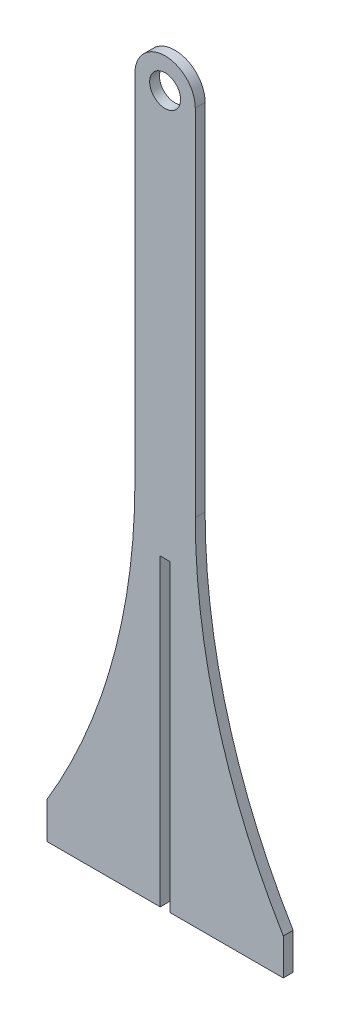
ISO-10303-21;
HEADER;
FILE_DESCRIPTION(('STEP AP214'),'2;1');
FILE_NAME('part.step','',(''),(''),'','','');
FILE_SCHEMA(('AUTOMOTIVE_DESIGN { 1 0 10303 214 1 1 1 1 }'));
ENDSEC;
DATA;
#1=APPLICATION_CONTEXT('core data for automotive mechanical design processes');
#2=APPLICATION_PROTOCOL_DEFINITION('international standard','automotive_design',2000,#1);
#3=PRODUCT_CONTEXT('',#1,'mechanical');
#4=PRODUCT('Part','Part','',(#3));
#5=PRODUCT_RELATED_PRODUCT_CATEGORY('part','',(#4));
#6=PRODUCT_DEFINITION_FORMATION('','',#4);
#7=PRODUCT_DEFINITION_CONTEXT('part definition',#1,'design');
#8=PRODUCT_DEFINITION('design','',#6,#7);
#9=PRODUCT_DEFINITION_SHAPE('','',#8);
#10=(LENGTH_UNIT() NAMED_UNIT(*) SI_UNIT(.MILLI.,.METRE.));
#11=(NAMED_UNIT(*) PLANE_ANGLE_UNIT() SI_UNIT($,.RADIAN.));
#12=(NAMED_UNIT(*) SI_UNIT($,.STERADIAN.) SOLID_ANGLE_UNIT());
#13=UNCERTAINTY_MEASURE_WITH_UNIT(LENGTH_MEASURE(1.E-05),#10,'distance_accuracy_value','');
#14=(GEOMETRIC_REPRESENTATION_CONTEXT(3) GLOBAL_UNCERTAINTY_ASSIGNED_CONTEXT((#13)) GLOBAL_UNIT_ASSIGNED_CONTEXT((#10,
#11,#12)) REPRESENTATION_CONTEXT('',''));
#15=CARTESIAN_POINT('',(0.,0.,0.));
#16=DIRECTION('',(0.,0.,1.));
#17=DIRECTION('',(1.,0.,0.));
#18=AXIS2_PLACEMENT_3D('',#15,#16,#17);
#19=CARTESIAN_POINT('',(-65.0000000000001,0.,-5.4));
#20=DIRECTION('',(0.,-1.,0.));
#21=DIRECTION('',(1.,0.,0.));
#22=AXIS2_PLACEMENT_3D('',#19,#20,#21);
#23=PLANE('',#22);
#24=DIRECTION('',(1.,0.,0.));
#25=VECTOR('',#24,1.);
#26=CARTESIAN_POINT('',(-65.0000000000001,0.,0.));
#27=LINE('',#26,#25);
#28=CARTESIAN_POINT('',(2.69999999999999,0.,0.));
#29=VERTEX_POINT('',#28);
#30=CARTESIAN_POINT('',(65.0000000000001,0.,0.));
#31=VERTEX_POINT('',#30);
#32=EDGE_CURVE('E162',#29,#31,#27,.T.);
#33=ORIENTED_EDGE('',*,*,#32,.F.);
#34=DIRECTION('',(0.,0.,1.));
#35=VECTOR('',#34,1.);
#36=CARTESIAN_POINT('',(2.7,0.,-84.65));
#37=LINE('',#36,#35);
#38=CARTESIAN_POINT('',(2.7,0.,-5.40000000000003));
#39=VERTEX_POINT('',#38);
#40=EDGE_CURVE('E48',#39,#29,#37,.T.);
#41=ORIENTED_EDGE('',*,*,#40,.F.);
#42=DIRECTION('',(1.,0.,0.));
#43=VECTOR('',#42,1.);
#44=CARTESIAN_POINT('',(-65.0000000000001,0.,-5.4));
#45=LINE('',#44,#43);
#46=CARTESIAN_POINT('',(65.0000000000001,0.,-5.4));
#47=VERTEX_POINT('',#46);
#48=EDGE_CURVE('E144',#39,#47,#45,.T.);
#49=ORIENTED_EDGE('',*,*,#48,.T.);
#50=DIRECTION('',(0.,0.,1.));
#51=VECTOR('',#50,1.);
#52=CARTESIAN_POINT('',(65.0000000000001,0.,-5.4));
#53=LINE('',#52,#51);
#54=EDGE_CURVE('E127',#47,#31,#53,.T.);
#55=ORIENTED_EDGE('',*,*,#54,.T.);
#56=EDGE_LOOP('',(#33,#41,#49,#55));
#57=FACE_BOUND('',#56,.T.);
#58=ADVANCED_FACE('F33',(#57),#23,.T.);
#59=CARTESIAN_POINT('',(0.,390.,-5.4));
#60=DIRECTION('',(0.,0.,1.));
#61=DIRECTION('',(1.,0.,0.));
#62=AXIS2_PLACEMENT_3D('',#59,#60,#61);
#63=CYLINDRICAL_SURFACE('',#62,16.6);
#64=CARTESIAN_POINT('',(0.,390.,0.));
#65=DIRECTION('',(0.,0.,1.));
#66=DIRECTION('',(1.,0.,0.));
#67=AXIS2_PLACEMENT_3D('',#64,#65,#66);
#68=CIRCLE('',#67,16.6);
#69=CARTESIAN_POINT('',(16.6,390.,0.));
#70=VERTEX_POINT('',#69);
#71=CARTESIAN_POINT('',(-16.6,390.,0.));
#72=VERTEX_POINT('',#71);
#73=EDGE_CURVE('E149',#70,#72,#68,.T.);
#74=ORIENTED_EDGE('',*,*,#73,.F.);
#75=DIRECTION('',(0.,0.,1.));
#76=VECTOR('',#75,1.);
#77=CARTESIAN_POINT('',(16.6,390.,-5.4));
#78=LINE('',#77,#76);
#79=CARTESIAN_POINT('',(16.6,390.,-5.4));
#80=VERTEX_POINT('',#79);
#81=EDGE_CURVE('E57',#80,#70,#78,.T.);
#82=ORIENTED_EDGE('',*,*,#81,.F.);
#83=CARTESIAN_POINT('',(0.,390.,-5.4));
#84=DIRECTION('',(0.,0.,1.));
#85=DIRECTION('',(1.,0.,0.));
#86=AXIS2_PLACEMENT_3D('',#83,#84,#85);
#87=CIRCLE('',#86,16.6);
#88=CARTESIAN_POINT('',(-16.6,390.,-5.4));
#89=VERTEX_POINT('',#88);
#90=EDGE_CURVE('E172',#80,#89,#87,.T.);
#91=ORIENTED_EDGE('',*,*,#90,.T.);
#92=DIRECTION('',(0.,0.,1.));
#93=VECTOR('',#92,1.);
#94=CARTESIAN_POINT('',(-16.6,390.,-5.4));
#95=LINE('',#94,#93);
#96=EDGE_CURVE('E96',#89,#72,#95,.T.);
#97=ORIENTED_EDGE('',*,*,#96,.T.);
#98=EDGE_LOOP('',(#74,#82,#91,#97));
#99=FACE_BOUND('',#98,.T.);
#100=ADVANCED_FACE('F35',(#99),#63,.T.);
#101=CARTESIAN_POINT('',(16.6,390.,-5.4));
#102=DIRECTION('',(1.,0.,0.));
#103=DIRECTION('',(0.,0.,-1.));
#104=AXIS2_PLACEMENT_3D('',#101,#102,#103);
#105=PLANE('',#104);
#106=DIRECTION('',(0.,1.,0.));
#107=VECTOR('',#106,1.);
#108=CARTESIAN_POINT('',(16.6,390.,0.));
#109=LINE('',#108,#107);
#110=CARTESIAN_POINT('',(16.5999999999999,195.,0.));
#111=VERTEX_POINT('',#110);
#112=EDGE_CURVE('E169',#111,#70,#109,.T.);
#113=ORIENTED_EDGE('',*,*,#112,.F.);
#114=DIRECTION('',(0.,0.,1.));
#115=VECTOR('',#114,1.);
#116=CARTESIAN_POINT('',(16.5999999999999,195.,-5.4));
#117=LINE('',#116,#115);
#118=CARTESIAN_POINT('',(16.5999999999999,195.,-5.4));
#119=VERTEX_POINT('',#118);
#120=EDGE_CURVE('E126',#119,#111,#117,.T.);
#121=ORIENTED_EDGE('',*,*,#120,.F.);
#122=DIRECTION('',(0.,1.,0.));
#123=VECTOR('',#122,1.);
#124=CARTESIAN_POINT('',(16.6,390.,-5.4));
#125=LINE('',#124,#123);
#126=EDGE_CURVE('E136',#119,#80,#125,.T.);
#127=ORIENTED_EDGE('',*,*,#126,.T.);
#128=ORIENTED_EDGE('',*,*,#81,.T.);
#129=EDGE_LOOP('',(#113,#121,#127,#128));
#130=FACE_BOUND('',#129,.T.);
#131=ADVANCED_FACE('F195',(#130),#105,.T.);
#132=CARTESIAN_POINT('',(357.173966942148,195.,-5.4));
#133=DIRECTION('',(0.,0.,1.));
#134=DIRECTION('',(1.,0.,0.));
#135=AXIS2_PLACEMENT_3D('',#132,#133,#134);
#136=CYLINDRICAL_SURFACE('',#135,340.573966942148);
#137=CARTESIAN_POINT('',(357.173966942148,195.,0.));
#138=DIRECTION('',(0.,0.,-1.));
#139=DIRECTION('',(1.,0.,0.));
#140=AXIS2_PLACEMENT_3D('',#137,#138,#139);
#141=CIRCLE('',#140,340.573966942148);
#142=CARTESIAN_POINT('',(65.0000000000001,20.,0.));
#143=VERTEX_POINT('',#142);
#144=EDGE_CURVE('E121',#143,#111,#141,.T.);
#145=ORIENTED_EDGE('',*,*,#144,.F.);
#146=DIRECTION('',(0.,0.,1.));
#147=VECTOR('',#146,1.);
#148=CARTESIAN_POINT('',(65.0000000000001,20.,-5.4));
#149=LINE('',#148,#147);
#150=CARTESIAN_POINT('',(65.0000000000001,20.,-5.4));
#151=VERTEX_POINT('',#150);
#152=EDGE_CURVE('E115',#151,#143,#149,.T.);
#153=ORIENTED_EDGE('',*,*,#152,.F.);
#154=CARTESIAN_POINT('',(357.173966942148,195.,-5.4));
#155=DIRECTION('',(0.,0.,-1.));
#156=DIRECTION('',(1.,0.,0.));
#157=AXIS2_PLACEMENT_3D('',#154,#155,#156);
#158=CIRCLE('',#157,340.573966942148);
#159=EDGE_CURVE('E118',#151,#119,#158,.T.);
#160=ORIENTED_EDGE('',*,*,#159,.T.);
#161=ORIENTED_EDGE('',*,*,#120,.T.);
#162=EDGE_LOOP('',(#145,#153,#160,#161));
#163=FACE_BOUND('',#162,.T.);
#164=ADVANCED_FACE('F117',(#163),#136,.F.);
#165=CARTESIAN_POINT('',(65.0000000000001,0.,-5.4));
#166=DIRECTION('',(1.,0.,0.));
#167=DIRECTION('',(0.,0.,-1.));
#168=AXIS2_PLACEMENT_3D('',#165,#166,#167);
#169=PLANE('',#168);
#170=DIRECTION('',(0.,1.,0.));
#171=VECTOR('',#170,1.);
#172=CARTESIAN_POINT('',(65.0000000000001,0.,0.));
#173=LINE('',#172,#171);
#174=EDGE_CURVE('E166',#31,#143,#173,.T.);
#175=ORIENTED_EDGE('',*,*,#174,.F.);
#176=ORIENTED_EDGE('',*,*,#54,.F.);
#177=DIRECTION('',(0.,1.,0.));
#178=VECTOR('',#177,1.);
#179=CARTESIAN_POINT('',(65.0000000000001,0.,-5.4));
#180=LINE('',#179,#178);
#181=EDGE_CURVE('E135',#47,#151,#180,.T.);
#182=ORIENTED_EDGE('',*,*,#181,.T.);
#183=ORIENTED_EDGE('',*,*,#152,.T.);
#184=EDGE_LOOP('',(#175,#176,#182,#183));
#185=FACE_BOUND('',#184,.T.);
#186=ADVANCED_FACE('F139',(#185),#169,.T.);
#187=DIRECTION('',(0.,0.,1.));
#188=VECTOR('',#187,1.);
#189=CARTESIAN_POINT('',(-2.7,0.,-84.65));
#190=LINE('',#189,#188);
#191=CARTESIAN_POINT('',(-2.7,0.,-5.40000000000003));
#192=VERTEX_POINT('',#191);
#193=CARTESIAN_POINT('',(-2.7,0.,0.));
#194=VERTEX_POINT('',#193);
#195=EDGE_CURVE('E223',#192,#194,#190,.T.);
#196=ORIENTED_EDGE('',*,*,#195,.T.);
#197=CARTESIAN_POINT('',(-65.0000000000001,0.,0.));
#198=VERTEX_POINT('',#197);
#199=EDGE_CURVE('E163',#198,#194,#27,.T.);
#200=ORIENTED_EDGE('',*,*,#199,.F.);
#201=DIRECTION('',(0.,0.,1.));
#202=VECTOR('',#201,1.);
#203=CARTESIAN_POINT('',(-65.0000000000001,0.,-5.4));
#204=LINE('',#203,#202);
#205=CARTESIAN_POINT('',(-65.0000000000001,0.,-5.4));
#206=VERTEX_POINT('',#205);
#207=EDGE_CURVE('E176',#206,#198,#204,.T.);
#208=ORIENTED_EDGE('',*,*,#207,.F.);
#209=EDGE_CURVE('E141',#206,#192,#45,.T.);
#210=ORIENTED_EDGE('',*,*,#209,.T.);
#211=EDGE_LOOP('',(#196,#200,#208,#210));
#212=FACE_BOUND('',#211,.T.);
#213=ADVANCED_FACE('F206',(#212),#23,.T.);
#214=CARTESIAN_POINT('',(-65.0000000000001,0.,-5.4));
#215=DIRECTION('',(-1.,0.,0.));
#216=DIRECTION('',(0.,0.,1.));
#217=AXIS2_PLACEMENT_3D('',#214,#215,#216);
#218=PLANE('',#217);
#219=DIRECTION('',(0.,-1.,0.));
#220=VECTOR('',#219,1.);
#221=CARTESIAN_POINT('',(-65.0000000000001,0.,0.));
#222=LINE('',#221,#220);
#223=CARTESIAN_POINT('',(-65.0000000000001,20.,0.));
#224=VERTEX_POINT('',#223);
#225=EDGE_CURVE('E159',#224,#198,#222,.T.);
#226=ORIENTED_EDGE('',*,*,#225,.F.);
#227=DIRECTION('',(0.,0.,1.));
#228=VECTOR('',#227,1.);
#229=CARTESIAN_POINT('',(-65.0000000000001,20.,-5.4));
#230=LINE('',#229,#228);
#231=CARTESIAN_POINT('',(-65.0000000000001,20.,-5.4));
#232=VERTEX_POINT('',#231);
#233=EDGE_CURVE('E178',#232,#224,#230,.T.);
#234=ORIENTED_EDGE('',*,*,#233,.F.);
#235=DIRECTION('',(0.,-1.,0.));
#236=VECTOR('',#235,1.);
#237=CARTESIAN_POINT('',(-65.0000000000001,0.,-5.4));
#238=LINE('',#237,#236);
#239=EDGE_CURVE('E237',#232,#206,#238,.T.);
#240=ORIENTED_EDGE('',*,*,#239,.T.);
#241=ORIENTED_EDGE('',*,*,#207,.T.);
#242=EDGE_LOOP('',(#226,#234,#240,#241));
#243=FACE_BOUND('',#242,.T.);
#244=ADVANCED_FACE('F212',(#243),#218,.T.);
#245=CARTESIAN_POINT('',(-357.173966942148,195.,-5.4));
#246=DIRECTION('',(0.,0.,1.));
#247=DIRECTION('',(1.,0.,0.));
#248=AXIS2_PLACEMENT_3D('',#245,#246,#247);
#249=CYLINDRICAL_SURFACE('',#248,340.573966942148);
#250=CARTESIAN_POINT('',(-357.173966942148,195.,0.));
#251=DIRECTION('',(0.,0.,-1.));
#252=DIRECTION('',(1.,0.,0.));
#253=AXIS2_PLACEMENT_3D('',#250,#251,#252);
#254=CIRCLE('',#253,340.573966942148);
#255=CARTESIAN_POINT('',(-16.6,195.,0.));
#256=VERTEX_POINT('',#255);
#257=EDGE_CURVE('E156',#256,#224,#254,.T.);
#258=ORIENTED_EDGE('',*,*,#257,.F.);
#259=DIRECTION('',(0.,0.,1.));
#260=VECTOR('',#259,1.);
#261=CARTESIAN_POINT('',(-16.6,195.,-5.4));
#262=LINE('',#261,#260);
#263=CARTESIAN_POINT('',(-16.6,195.,-5.4));
#264=VERTEX_POINT('',#263);
#265=EDGE_CURVE('E180',#264,#256,#262,.T.);
#266=ORIENTED_EDGE('',*,*,#265,.F.);
#267=CARTESIAN_POINT('',(-357.173966942148,195.,-5.4));
#268=DIRECTION('',(0.,0.,-1.));
#269=DIRECTION('',(1.,0.,0.));
#270=AXIS2_PLACEMENT_3D('',#267,#268,#269);
#271=CIRCLE('',#270,340.573966942148);
#272=EDGE_CURVE('E260',#264,#232,#271,.T.);
#273=ORIENTED_EDGE('',*,*,#272,.T.);
#274=ORIENTED_EDGE('',*,*,#233,.T.);
#275=EDGE_LOOP('',(#258,#266,#273,#274));
#276=FACE_BOUND('',#275,.T.);
#277=ADVANCED_FACE('F218',(#276),#249,.F.);
#278=CARTESIAN_POINT('',(-16.6,390.,-5.4));
#279=DIRECTION('',(-1.,0.,0.));
#280=DIRECTION('',(0.,0.,1.));
#281=AXIS2_PLACEMENT_3D('',#278,#279,#280);
#282=PLANE('',#281);
#283=DIRECTION('',(0.,-1.,0.));
#284=VECTOR('',#283,1.);
#285=CARTESIAN_POINT('',(-16.6,390.,0.));
#286=LINE('',#285,#284);
#287=EDGE_CURVE('E152',#72,#256,#286,.T.);
#288=ORIENTED_EDGE('',*,*,#287,.F.);
#289=ORIENTED_EDGE('',*,*,#96,.F.);
#290=DIRECTION('',(0.,-1.,0.));
#291=VECTOR('',#290,1.);
#292=CARTESIAN_POINT('',(-16.6,390.,-5.4));
#293=LINE('',#292,#291);
#294=EDGE_CURVE('E258',#89,#264,#293,.T.);
#295=ORIENTED_EDGE('',*,*,#294,.T.);
#296=ORIENTED_EDGE('',*,*,#265,.T.);
#297=EDGE_LOOP('',(#288,#289,#295,#296));
#298=FACE_BOUND('',#297,.T.);
#299=ADVANCED_FACE('F262',(#298),#282,.T.);
#300=CARTESIAN_POINT('',(0.,390.,-5.4));
#301=DIRECTION('',(0.,0.,1.));
#302=DIRECTION('',(1.,0.,0.));
#303=AXIS2_PLACEMENT_3D('',#300,#301,#302);
#304=PLANE('',#303);
#305=DIRECTION('',(1.,0.,0.));
#306=VECTOR('',#305,1.);
#307=CARTESIAN_POINT('',(-2.7,167.1,-5.39999999999999));
#308=LINE('',#307,#306);
#309=CARTESIAN_POINT('',(-2.7,167.1,-5.39999999999999));
#310=VERTEX_POINT('',#309);
#311=CARTESIAN_POINT('',(2.7,167.1,-5.39999999999999));
#312=VERTEX_POINT('',#311);
#313=EDGE_CURVE('E244',#310,#312,#308,.T.);
#314=ORIENTED_EDGE('',*,*,#313,.F.);
#315=DIRECTION('',(0.,-1.,0.));
#316=VECTOR('',#315,1.);
#317=CARTESIAN_POINT('',(-2.7,390.,-5.4));
#318=LINE('',#317,#316);
#319=EDGE_CURVE('E240',#310,#192,#318,.T.);
#320=ORIENTED_EDGE('',*,*,#319,.T.);
#321=ORIENTED_EDGE('',*,*,#209,.F.);
#322=ORIENTED_EDGE('',*,*,#239,.F.);
#323=ORIENTED_EDGE('',*,*,#272,.F.);
#324=ORIENTED_EDGE('',*,*,#294,.F.);
#325=ORIENTED_EDGE('',*,*,#90,.F.);
#326=ORIENTED_EDGE('',*,*,#126,.F.);
#327=ORIENTED_EDGE('',*,*,#159,.F.);
#328=ORIENTED_EDGE('',*,*,#181,.F.);
#329=ORIENTED_EDGE('',*,*,#48,.F.);
#330=DIRECTION('',(0.,-1.,0.));
#331=VECTOR('',#330,1.);
#332=CARTESIAN_POINT('',(2.7,390.,-5.4));
#333=LINE('',#332,#331);
#334=EDGE_CURVE('E248',#312,#39,#333,.T.);
#335=ORIENTED_EDGE('',*,*,#334,.F.);
#336=EDGE_LOOP('',(#314,#320,#321,#322,#323,#324,#325,#326,#327,#328,#329,#335));
#337=FACE_BOUND('',#336,.T.);
#338=CARTESIAN_POINT('',(0.,390.,-5.4));
#339=DIRECTION('',(0.,0.,1.));
#340=DIRECTION('',(1.,0.,0.));
#341=AXIS2_PLACEMENT_3D('',#338,#339,#340);
#342=CIRCLE('',#341,8.5);
#343=CARTESIAN_POINT('',(8.5,390.,-5.4));
#344=VERTEX_POINT('',#343);
#345=EDGE_CURVE('E153',#344,#344,#342,.T.);
#346=ORIENTED_EDGE('',*,*,#345,.T.);
#347=EDGE_LOOP('',(#346));
#348=FACE_BOUND('',#347,.T.);
#349=ADVANCED_FACE('F132',(#337,#348),#304,.F.);
#350=CARTESIAN_POINT('',(0.,390.,0.));
#351=DIRECTION('',(0.,0.,1.));
#352=DIRECTION('',(1.,0.,0.));
#353=AXIS2_PLACEMENT_3D('',#350,#351,#352);
#354=PLANE('',#353);
#355=DIRECTION('',(0.,-1.,0.));
#356=VECTOR('',#355,1.);
#357=CARTESIAN_POINT('',(-2.7,390.,0.));
#358=LINE('',#357,#356);
#359=CARTESIAN_POINT('',(-2.7,167.1,0.));
#360=VERTEX_POINT('',#359);
#361=EDGE_CURVE('E11',#360,#194,#358,.T.);
#362=ORIENTED_EDGE('',*,*,#361,.F.);
#363=DIRECTION('',(1.,0.,0.));
#364=VECTOR('',#363,1.);
#365=CARTESIAN_POINT('',(-2.7,167.1,0.));
#366=LINE('',#365,#364);
#367=CARTESIAN_POINT('',(2.7,167.1,0.));
#368=VERTEX_POINT('',#367);
#369=EDGE_CURVE('E190',#360,#368,#366,.T.);
#370=ORIENTED_EDGE('',*,*,#369,.T.);
#371=DIRECTION('',(0.,-1.,0.));
#372=VECTOR('',#371,1.);
#373=CARTESIAN_POINT('',(2.7,390.,0.));
#374=LINE('',#373,#372);
#375=EDGE_CURVE('E41',#368,#29,#374,.T.);
#376=ORIENTED_EDGE('',*,*,#375,.T.);
#377=ORIENTED_EDGE('',*,*,#32,.T.);
#378=ORIENTED_EDGE('',*,*,#174,.T.);
#379=ORIENTED_EDGE('',*,*,#144,.T.);
#380=ORIENTED_EDGE('',*,*,#112,.T.);
#381=ORIENTED_EDGE('',*,*,#73,.T.);
#382=ORIENTED_EDGE('',*,*,#287,.T.);
#383=ORIENTED_EDGE('',*,*,#257,.T.);
#384=ORIENTED_EDGE('',*,*,#225,.T.);
#385=ORIENTED_EDGE('',*,*,#199,.T.);
#386=EDGE_LOOP('',(#362,#370,#376,#377,#378,#379,#380,#381,#382,#383,#384,#385));
#387=FACE_BOUND('',#386,.T.);
#388=CARTESIAN_POINT('',(0.,390.,0.));
#389=DIRECTION('',(0.,0.,1.));
#390=DIRECTION('',(1.,0.,0.));
#391=AXIS2_PLACEMENT_3D('',#388,#389,#390);
#392=CIRCLE('',#391,8.5);
#393=CARTESIAN_POINT('',(8.5,390.,0.));
#394=VERTEX_POINT('',#393);
#395=EDGE_CURVE('E247',#394,#394,#392,.T.);
#396=ORIENTED_EDGE('',*,*,#395,.F.);
#397=EDGE_LOOP('',(#396));
#398=FACE_BOUND('',#397,.T.);
#399=ADVANCED_FACE('F186',(#387,#398),#354,.T.);
#400=CARTESIAN_POINT('',(0.,390.,-5.4));
#401=DIRECTION('',(0.,0.,1.));
#402=DIRECTION('',(1.,0.,0.));
#403=AXIS2_PLACEMENT_3D('',#400,#401,#402);
#404=CYLINDRICAL_SURFACE('',#403,8.5);
#405=CARTESIAN_POINT('',(8.5,390.,-5.4));
#406=CARTESIAN_POINT('',(8.5,390.,-5.34375));
#407=CARTESIAN_POINT('',(8.5,390.,-5.2875));
#408=CARTESIAN_POINT('',(8.5,390.,-5.175));
#409=CARTESIAN_POINT('',(8.5,390.,-5.11875));
#410=CARTESIAN_POINT('',(8.5,390.,-5.00625));
#411=CARTESIAN_POINT('',(8.5,390.,-4.95));
#412=CARTESIAN_POINT('',(8.5,390.,-4.8375));
#413=CARTESIAN_POINT('',(8.5,390.,-4.78125));
#414=CARTESIAN_POINT('',(8.5,390.,-4.66875));
#415=CARTESIAN_POINT('',(8.5,390.,-4.6125));
#416=CARTESIAN_POINT('',(8.5,390.,-4.5));
#417=CARTESIAN_POINT('',(8.5,390.,-4.44375));
#418=CARTESIAN_POINT('',(8.5,390.,-4.33125));
#419=CARTESIAN_POINT('',(8.5,390.,-4.275));
#420=CARTESIAN_POINT('',(8.5,390.,-4.1625));
#421=CARTESIAN_POINT('',(8.5,390.,-4.10625));
#422=CARTESIAN_POINT('',(8.5,390.,-3.99375));
#423=CARTESIAN_POINT('',(8.5,390.,-3.9375));
#424=CARTESIAN_POINT('',(8.5,390.,-3.825));
#425=CARTESIAN_POINT('',(8.5,390.,-3.76875));
#426=CARTESIAN_POINT('',(8.5,390.,-3.65625));
#427=CARTESIAN_POINT('',(8.5,390.,-3.6));
#428=CARTESIAN_POINT('',(8.5,390.,-3.4875));
#429=CARTESIAN_POINT('',(8.5,390.,-3.43125));
#430=CARTESIAN_POINT('',(8.5,390.,-3.31875));
#431=CARTESIAN_POINT('',(8.5,390.,-3.2625));
#432=CARTESIAN_POINT('',(8.5,390.,-3.15));
#433=CARTESIAN_POINT('',(8.5,390.,-3.09375));
#434=CARTESIAN_POINT('',(8.5,390.,-2.98125));
#435=CARTESIAN_POINT('',(8.5,390.,-2.925));
#436=CARTESIAN_POINT('',(8.5,390.,-2.8125));
#437=CARTESIAN_POINT('',(8.5,390.,-2.75625));
#438=CARTESIAN_POINT('',(8.5,390.,-2.64375));
#439=CARTESIAN_POINT('',(8.5,390.,-2.5875));
#440=CARTESIAN_POINT('',(8.5,390.,-2.475));
#441=CARTESIAN_POINT('',(8.5,390.,-2.41875));
#442=CARTESIAN_POINT('',(8.5,390.,-2.30625));
#443=CARTESIAN_POINT('',(8.5,390.,-2.25));
#444=CARTESIAN_POINT('',(8.5,390.,-2.1375));
#445=CARTESIAN_POINT('',(8.5,390.,-2.08125));
#446=CARTESIAN_POINT('',(8.5,390.,-1.96875));
#447=CARTESIAN_POINT('',(8.5,390.,-1.9125));
#448=CARTESIAN_POINT('',(8.5,390.,-1.8));
#449=CARTESIAN_POINT('',(8.5,390.,-1.74375));
#450=CARTESIAN_POINT('',(8.5,390.,-1.63125));
#451=CARTESIAN_POINT('',(8.5,390.,-1.575));
#452=CARTESIAN_POINT('',(8.5,390.,-1.4625));
#453=CARTESIAN_POINT('',(8.5,390.,-1.40625));
#454=CARTESIAN_POINT('',(8.5,390.,-1.29375));
#455=CARTESIAN_POINT('',(8.5,390.,-1.2375));
#456=CARTESIAN_POINT('',(8.5,390.,-1.125));
#457=CARTESIAN_POINT('',(8.5,390.,-1.06875));
#458=CARTESIAN_POINT('',(8.5,390.,-0.956250000000001));
#459=CARTESIAN_POINT('',(8.5,390.,-0.900000000000001));
#460=CARTESIAN_POINT('',(8.5,390.,-0.787500000000001));
#461=CARTESIAN_POINT('',(8.5,390.,-0.731250000000001));
#462=CARTESIAN_POINT('',(8.5,390.,-0.618750000000001));
#463=CARTESIAN_POINT('',(8.5,390.,-0.562500000000001));
#464=CARTESIAN_POINT('',(8.5,390.,-0.450000000000001));
#465=CARTESIAN_POINT('',(8.5,390.,-0.393750000000001));
#466=CARTESIAN_POINT('',(8.5,390.,-0.281250000000001));
#467=CARTESIAN_POINT('',(8.5,390.,-0.225000000000001));
#468=CARTESIAN_POINT('',(8.5,390.,-0.112500000000001));
#469=CARTESIAN_POINT('',(8.5,390.,-0.0562500000000007));
#470=CARTESIAN_POINT('',(8.5,390.,0.));
#471=B_SPLINE_CURVE_WITH_KNOTS('',3,(#405,#406,#407,#408,#409,#410,#411,#412,#413,#414,#415,
#416,#417,#418,#419,#420,#421,#422,#423,#424,#425,#426,#427,#428,#429,#430,#431,#432,#433,#434,
#435,#436,#437,#438,#439,#440,#441,#442,#443,#444,#445,#446,#447,#448,#449,#450,#451,#452,#453,
#454,#455,#456,#457,#458,#459,#460,#461,#462,#463,#464,#465,#466,#467,#468,#469,#470),
.UNSPECIFIED.,.F.,.F.,(4,2,2,2,2,2,2,2,2,2,2,2,2,2,2,2,2,2,2,2,2,2,2,2,2,2,2,2,2,2,2,2,4),(0.,
0.16875,0.337499999999999,0.50625,0.674999999999999,0.84375,1.0125,1.18125,1.35,1.51875,1.6875,
1.85625,2.025,2.19375,2.3625,2.53125,2.7,2.86875,3.0375,3.20625,3.375,3.54375,3.7125,3.88125,
4.05,4.21875,4.3875,4.55625,4.725,4.89375,5.0625,5.23125,5.4),.UNSPECIFIED.);
#472=EDGE_CURVE('BSEAM321',#344,#394,#471,.T.);
#473=ORIENTED_EDGE('',*,*,#345,.F.);
#474=ORIENTED_EDGE('',*,*,#395,.T.);
#475=ORIENTED_EDGE('',*,*,#472,.T.);
#476=ORIENTED_EDGE('',*,*,#472,.F.);
#477=EDGE_LOOP('',(#473,#475,#474,#476));
#478=FACE_BOUND('',#477,.T.);
#479=ADVANCED_FACE('F321',(#478),#404,.F.);
#480=CARTESIAN_POINT('',(-2.7,0.,-22.35));
#481=DIRECTION('',(-1.,0.,0.));
#482=DIRECTION('',(0.,0.,1.));
#483=AXIS2_PLACEMENT_3D('',#480,#481,#482);
#484=PLANE('',#483);
#485=DIRECTION('',(0.,0.,-1.));
#486=VECTOR('',#485,1.);
#487=CARTESIAN_POINT('',(-2.7,167.1,0.));
#488=LINE('',#487,#486);
#489=EDGE_CURVE('E229',#360,#310,#488,.T.);
#490=ORIENTED_EDGE('',*,*,#489,.F.);
#491=ORIENTED_EDGE('',*,*,#361,.T.);
#492=ORIENTED_EDGE('',*,*,#195,.F.);
#493=ORIENTED_EDGE('',*,*,#319,.F.);
#494=EDGE_LOOP('',(#490,#491,#492,#493));
#495=FACE_BOUND('',#494,.T.);
#496=ADVANCED_FACE('F327',(#495),#484,.F.);
#497=CARTESIAN_POINT('',(2.7,0.,-22.35));
#498=DIRECTION('',(-1.,0.,0.));
#499=DIRECTION('',(0.,0.,1.));
#500=AXIS2_PLACEMENT_3D('',#497,#498,#499);
#501=PLANE('',#500);
#502=ORIENTED_EDGE('',*,*,#334,.T.);
#503=ORIENTED_EDGE('',*,*,#40,.T.);
#504=ORIENTED_EDGE('',*,*,#375,.F.);
#505=DIRECTION('',(0.,0.,-1.));
#506=VECTOR('',#505,1.);
#507=CARTESIAN_POINT('',(2.7,167.1,0.));
#508=LINE('',#507,#506);
#509=EDGE_CURVE('E230',#368,#312,#508,.T.);
#510=ORIENTED_EDGE('',*,*,#509,.T.);
#511=EDGE_LOOP('',(#502,#503,#504,#510));
#512=FACE_BOUND('',#511,.T.);
#513=ADVANCED_FACE('F332',(#512),#501,.T.);
#514=CARTESIAN_POINT('',(-2.7,167.1,0.));
#515=DIRECTION('',(0.,-1.,0.));
#516=DIRECTION('',(1.,0.,0.));
#517=AXIS2_PLACEMENT_3D('',#514,#515,#516);
#518=PLANE('',#517);
#519=ORIENTED_EDGE('',*,*,#509,.F.);
#520=ORIENTED_EDGE('',*,*,#369,.F.);
#521=ORIENTED_EDGE('',*,*,#489,.T.);
#522=ORIENTED_EDGE('',*,*,#313,.T.);
#523=EDGE_LOOP('',(#519,#520,#521,#522));
#524=FACE_BOUND('',#523,.T.);
#525=ADVANCED_FACE('F341',(#524),#518,.T.);
#526=CLOSED_SHELL('',(#58,#100,#131,#164,#186,#213,#244,#277,#299,#349,#399,#479,#496,#513,#525));
#527=MANIFOLD_SOLID_BREP('B2',#526);
#528=ADVANCED_BREP_SHAPE_REPRESENTATION('',(#18,#527),#14);
#529=SHAPE_DEFINITION_REPRESENTATION(#9,#528);
ENDSEC;
END-ISO-10303-21;
